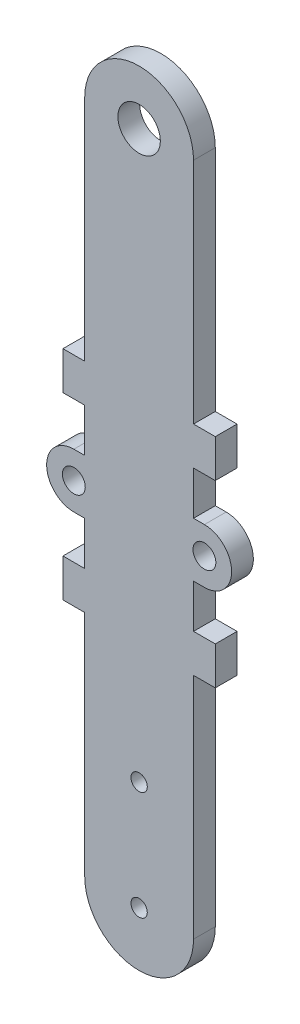
ISO-10303-21;
HEADER;
FILE_DESCRIPTION(('STEP AP214'),'2;1');
FILE_NAME('part.step','',(''),(''),'','','');
FILE_SCHEMA(('AUTOMOTIVE_DESIGN { 1 0 10303 214 1 1 1 1 }'));
ENDSEC;
DATA;
#1=APPLICATION_CONTEXT('core data for automotive mechanical design processes');
#2=APPLICATION_PROTOCOL_DEFINITION('international standard','automotive_design',2000,#1);
#3=PRODUCT_CONTEXT('',#1,'mechanical');
#4=PRODUCT('Part','Part','',(#3));
#5=PRODUCT_RELATED_PRODUCT_CATEGORY('part','',(#4));
#6=PRODUCT_DEFINITION_FORMATION('','',#4);
#7=PRODUCT_DEFINITION_CONTEXT('part definition',#1,'design');
#8=PRODUCT_DEFINITION('design','',#6,#7);
#9=PRODUCT_DEFINITION_SHAPE('','',#8);
#10=(LENGTH_UNIT() NAMED_UNIT(*) SI_UNIT(.MILLI.,.METRE.));
#11=(NAMED_UNIT(*) PLANE_ANGLE_UNIT() SI_UNIT($,.RADIAN.));
#12=(NAMED_UNIT(*) SI_UNIT($,.STERADIAN.) SOLID_ANGLE_UNIT());
#13=UNCERTAINTY_MEASURE_WITH_UNIT(LENGTH_MEASURE(1.E-05),#10,'distance_accuracy_value','');
#14=(GEOMETRIC_REPRESENTATION_CONTEXT(3) GLOBAL_UNCERTAINTY_ASSIGNED_CONTEXT((#13)) GLOBAL_UNIT_ASSIGNED_CONTEXT((#10,
#11,#12)) REPRESENTATION_CONTEXT('',''));
#15=CARTESIAN_POINT('',(0.,0.,0.));
#16=DIRECTION('',(0.,0.,1.));
#17=DIRECTION('',(1.,0.,0.));
#18=AXIS2_PLACEMENT_3D('',#15,#16,#17);
#19=CARTESIAN_POINT('',(0.,0.,4.));
#20=DIRECTION('',(0.,0.,1.));
#21=DIRECTION('',(1.,0.,0.));
#22=AXIS2_PLACEMENT_3D('',#19,#20,#21);
#23=PLANE('',#22);
#24=DIRECTION('',(0.,1.,0.));
#25=VECTOR('',#24,1.);
#26=CARTESIAN_POINT('',(10.,-72.,4.));
#27=LINE('',#26,#25);
#28=CARTESIAN_POINT('',(10.,-62.,4.));
#29=VERTEX_POINT('',#28);
#30=CARTESIAN_POINT('',(10.,-20.0000000000001,4.));
#31=VERTEX_POINT('',#30);
#32=EDGE_CURVE('E427',#29,#31,#27,.T.);
#33=ORIENTED_EDGE('',*,*,#32,.T.);
#34=DIRECTION('',(1.,0.,0.));
#35=VECTOR('',#34,1.);
#36=CARTESIAN_POINT('',(1.35308431126197E-12,-20.0000000000009,4.));
#37=LINE('',#36,#35);
#38=CARTESIAN_POINT('',(14.,-20.,4.));
#39=VERTEX_POINT('',#38);
#40=EDGE_CURVE('E271',#31,#39,#37,.T.);
#41=ORIENTED_EDGE('',*,*,#40,.T.);
#42=DIRECTION('',(0.,1.,0.));
#43=VECTOR('',#42,1.);
#44=CARTESIAN_POINT('',(14.,0.,4.));
#45=LINE('',#44,#43);
#46=CARTESIAN_POINT('',(14.,-13.,4.));
#47=VERTEX_POINT('',#46);
#48=EDGE_CURVE('E263',#39,#47,#45,.T.);
#49=ORIENTED_EDGE('',*,*,#48,.T.);
#50=DIRECTION('',(1.,0.,0.));
#51=VECTOR('',#50,1.);
#52=CARTESIAN_POINT('',(8.79504802320303E-13,-13.0000000000009,4.));
#53=LINE('',#52,#51);
#54=CARTESIAN_POINT('',(10.,-13.0000000000001,4.));
#55=VERTEX_POINT('',#54);
#56=EDGE_CURVE('E279',#55,#47,#53,.T.);
#57=ORIENTED_EDGE('',*,*,#56,.F.);
#58=CARTESIAN_POINT('',(10.,-5.,4.));
#59=VERTEX_POINT('',#58);
#60=EDGE_CURVE('E431',#55,#59,#27,.T.);
#61=ORIENTED_EDGE('',*,*,#60,.T.);
#62=DIRECTION('',(1.,0.,0.));
#63=VECTOR('',#62,1.);
#64=CARTESIAN_POINT('',(0.,-5.00000000000003,4.));
#65=LINE('',#64,#63);
#66=CARTESIAN_POINT('',(12.,-5.,4.));
#67=VERTEX_POINT('',#66);
#68=EDGE_CURVE('E311',#59,#67,#65,.T.);
#69=ORIENTED_EDGE('',*,*,#68,.T.);
#70=CARTESIAN_POINT('',(12.,0.,4.));
#71=DIRECTION('',(0.,0.,-1.));
#72=DIRECTION('',(-1.,0.,0.));
#73=AXIS2_PLACEMENT_3D('',#70,#71,#72);
#74=CIRCLE('',#73,5.);
#75=CARTESIAN_POINT('',(12.,5.,4.));
#76=VERTEX_POINT('',#75);
#77=EDGE_CURVE('E297',#76,#67,#74,.T.);
#78=ORIENTED_EDGE('',*,*,#77,.F.);
#79=DIRECTION('',(1.,0.,0.));
#80=VECTOR('',#79,1.);
#81=CARTESIAN_POINT('',(0.,5.00000000000003,4.));
#82=LINE('',#81,#80);
#83=CARTESIAN_POINT('',(10.,5.,4.));
#84=VERTEX_POINT('',#83);
#85=EDGE_CURVE('E286',#84,#76,#82,.T.);
#86=ORIENTED_EDGE('',*,*,#85,.F.);
#87=CARTESIAN_POINT('',(10.,12.9999999999998,4.));
#88=VERTEX_POINT('',#87);
#89=EDGE_CURVE('E432',#84,#88,#27,.T.);
#90=ORIENTED_EDGE('',*,*,#89,.T.);
#91=DIRECTION('',(1.,0.,0.));
#92=VECTOR('',#91,1.);
#93=CARTESIAN_POINT('',(-8.56953397132483E-13,12.9999999999991,4.));
#94=LINE('',#93,#92);
#95=CARTESIAN_POINT('',(14.,13.,4.));
#96=VERTEX_POINT('',#95);
#97=EDGE_CURVE('E254',#88,#96,#94,.T.);
#98=ORIENTED_EDGE('',*,*,#97,.T.);
#99=DIRECTION('',(0.,-1.,0.));
#100=VECTOR('',#99,1.);
#101=CARTESIAN_POINT('',(14.,0.,4.));
#102=LINE('',#101,#100);
#103=CARTESIAN_POINT('',(14.,20.,4.));
#104=VERTEX_POINT('',#103);
#105=EDGE_CURVE('E249',#104,#96,#102,.T.);
#106=ORIENTED_EDGE('',*,*,#105,.F.);
#107=DIRECTION('',(1.,0.,0.));
#108=VECTOR('',#107,1.);
#109=CARTESIAN_POINT('',(-1.31838984174231E-12,19.9999999999991,4.));
#110=LINE('',#109,#108);
#111=CARTESIAN_POINT('',(10.,19.9999999999999,4.));
#112=VERTEX_POINT('',#111);
#113=EDGE_CURVE('E258',#112,#104,#110,.T.);
#114=ORIENTED_EDGE('',*,*,#113,.F.);
#115=CARTESIAN_POINT('',(10.,62.,4.));
#116=VERTEX_POINT('',#115);
#117=EDGE_CURVE('E52',#112,#116,#27,.T.);
#118=ORIENTED_EDGE('',*,*,#117,.T.);
#119=CARTESIAN_POINT('',(0.,62.,4.));
#120=DIRECTION('',(0.,0.,1.));
#121=DIRECTION('',(1.,0.,0.));
#122=AXIS2_PLACEMENT_3D('',#119,#120,#121);
#123=CIRCLE('',#122,10.);
#124=CARTESIAN_POINT('',(-10.,62.,4.));
#125=VERTEX_POINT('',#124);
#126=EDGE_CURVE('E448',#116,#125,#123,.T.);
#127=ORIENTED_EDGE('',*,*,#126,.T.);
#128=DIRECTION('',(0.,-1.,0.));
#129=VECTOR('',#128,1.);
#130=CARTESIAN_POINT('',(-10.,-72.,4.));
#131=LINE('',#130,#129);
#132=CARTESIAN_POINT('',(-10.,19.9999999999999,4.));
#133=VERTEX_POINT('',#132);
#134=EDGE_CURVE('E433',#125,#133,#131,.T.);
#135=ORIENTED_EDGE('',*,*,#134,.T.);
#136=DIRECTION('',(-1.,0.,0.));
#137=VECTOR('',#136,1.);
#138=CARTESIAN_POINT('',(1.31838984174231E-12,19.9999999999991,4.));
#139=LINE('',#138,#137);
#140=CARTESIAN_POINT('',(-14.,20.,4.));
#141=VERTEX_POINT('',#140);
#142=EDGE_CURVE('E330',#133,#141,#139,.T.);
#143=ORIENTED_EDGE('',*,*,#142,.T.);
#144=DIRECTION('',(0.,-1.,0.));
#145=VECTOR('',#144,1.);
#146=CARTESIAN_POINT('',(-14.,0.,4.));
#147=LINE('',#146,#145);
#148=CARTESIAN_POINT('',(-14.,13.,4.));
#149=VERTEX_POINT('',#148);
#150=EDGE_CURVE('E345',#141,#149,#147,.T.);
#151=ORIENTED_EDGE('',*,*,#150,.T.);
#152=DIRECTION('',(-1.,0.,0.));
#153=VECTOR('',#152,1.);
#154=CARTESIAN_POINT('',(8.56953397132483E-13,12.9999999999991,4.));
#155=LINE('',#154,#153);
#156=CARTESIAN_POINT('',(-10.,12.9999999999999,4.));
#157=VERTEX_POINT('',#156);
#158=EDGE_CURVE('E337',#157,#149,#155,.T.);
#159=ORIENTED_EDGE('',*,*,#158,.F.);
#160=CARTESIAN_POINT('',(-10.,5.,4.));
#161=VERTEX_POINT('',#160);
#162=EDGE_CURVE('E436',#157,#161,#131,.T.);
#163=ORIENTED_EDGE('',*,*,#162,.T.);
#164=DIRECTION('',(-1.,0.,0.));
#165=VECTOR('',#164,1.);
#166=CARTESIAN_POINT('',(0.,5.00000000000003,4.));
#167=LINE('',#166,#165);
#168=CARTESIAN_POINT('',(-12.,5.,4.));
#169=VERTEX_POINT('',#168);
#170=EDGE_CURVE('E376',#161,#169,#167,.T.);
#171=ORIENTED_EDGE('',*,*,#170,.T.);
#172=CARTESIAN_POINT('',(-12.,0.,4.));
#173=DIRECTION('',(0.,0.,1.));
#174=DIRECTION('',(1.,0.,0.));
#175=AXIS2_PLACEMENT_3D('',#172,#173,#174);
#176=CIRCLE('',#175,5.);
#177=CARTESIAN_POINT('',(-12.,-5.,4.));
#178=VERTEX_POINT('',#177);
#179=EDGE_CURVE('E399',#169,#178,#176,.T.);
#180=ORIENTED_EDGE('',*,*,#179,.T.);
#181=DIRECTION('',(-1.,0.,0.));
#182=VECTOR('',#181,1.);
#183=CARTESIAN_POINT('',(0.,-5.00000000000003,4.));
#184=LINE('',#183,#182);
#185=CARTESIAN_POINT('',(-10.,-5.,4.));
#186=VERTEX_POINT('',#185);
#187=EDGE_CURVE('E402',#186,#178,#184,.T.);
#188=ORIENTED_EDGE('',*,*,#187,.F.);
#189=CARTESIAN_POINT('',(-10.,-13.0000000000002,4.));
#190=VERTEX_POINT('',#189);
#191=EDGE_CURVE('E437',#186,#190,#131,.T.);
#192=ORIENTED_EDGE('',*,*,#191,.T.);
#193=DIRECTION('',(-1.,0.,0.));
#194=VECTOR('',#193,1.);
#195=CARTESIAN_POINT('',(-8.79504802320303E-13,-13.0000000000009,4.));
#196=LINE('',#195,#194);
#197=CARTESIAN_POINT('',(-14.,-13.,4.));
#198=VERTEX_POINT('',#197);
#199=EDGE_CURVE('E362',#190,#198,#196,.T.);
#200=ORIENTED_EDGE('',*,*,#199,.T.);
#201=DIRECTION('',(0.,1.,0.));
#202=VECTOR('',#201,1.);
#203=CARTESIAN_POINT('',(-14.,0.,4.));
#204=LINE('',#203,#202);
#205=CARTESIAN_POINT('',(-14.,-20.,4.));
#206=VERTEX_POINT('',#205);
#207=EDGE_CURVE('E352',#206,#198,#204,.T.);
#208=ORIENTED_EDGE('',*,*,#207,.F.);
#209=DIRECTION('',(-1.,0.,0.));
#210=VECTOR('',#209,1.);
#211=CARTESIAN_POINT('',(-1.35308431126197E-12,-20.0000000000009,4.));
#212=LINE('',#211,#210);
#213=CARTESIAN_POINT('',(-10.,-20.0000000000001,4.));
#214=VERTEX_POINT('',#213);
#215=EDGE_CURVE('E370',#214,#206,#212,.T.);
#216=ORIENTED_EDGE('',*,*,#215,.F.);
#217=CARTESIAN_POINT('',(-10.,-62.,4.));
#218=VERTEX_POINT('',#217);
#219=EDGE_CURVE('E430',#214,#218,#131,.T.);
#220=ORIENTED_EDGE('',*,*,#219,.T.);
#221=CARTESIAN_POINT('',(0.,-62.,4.));
#222=DIRECTION('',(0.,0.,1.));
#223=DIRECTION('',(1.,0.,0.));
#224=AXIS2_PLACEMENT_3D('',#221,#222,#223);
#225=CIRCLE('',#224,10.);
#226=EDGE_CURVE('E11',#218,#29,#225,.T.);
#227=ORIENTED_EDGE('',*,*,#226,.T.);
#228=EDGE_LOOP('',(#33,#41,#49,#57,#61,#69,#78,#86,#90,#98,#106,#114,#118,#127,#135,#143,#151,
#159,#163,#171,#180,#188,#192,#200,#208,#216,#220,#227));
#229=FACE_BOUND('',#228,.T.);
#230=CARTESIAN_POINT('',(-12.,0.,4.));
#231=DIRECTION('',(0.,0.,1.));
#232=DIRECTION('',(1.,0.,0.));
#233=AXIS2_PLACEMENT_3D('',#230,#231,#232);
#234=CIRCLE('',#233,2.1);
#235=CARTESIAN_POINT('',(-9.89999999999999,0.,4.));
#236=VERTEX_POINT('',#235);
#237=EDGE_CURVE('E388',#236,#236,#234,.T.);
#238=ORIENTED_EDGE('',*,*,#237,.F.);
#239=EDGE_LOOP('',(#238));
#240=FACE_BOUND('',#239,.T.);
#241=CARTESIAN_POINT('',(0.,-42.,4.));
#242=DIRECTION('',(0.,0.,-1.));
#243=DIRECTION('',(-1.,0.,0.));
#244=AXIS2_PLACEMENT_3D('',#241,#242,#243);
#245=CIRCLE('',#244,1.5);
#246=CARTESIAN_POINT('',(-1.5,-42.,4.));
#247=VERTEX_POINT('',#246);
#248=EDGE_CURVE('E327',#247,#247,#245,.T.);
#249=ORIENTED_EDGE('',*,*,#248,.T.);
#250=EDGE_LOOP('',(#249));
#251=FACE_BOUND('',#250,.T.);
#252=CARTESIAN_POINT('',(0.,-62.,4.));
#253=DIRECTION('',(0.,0.,1.));
#254=DIRECTION('',(1.,0.,0.));
#255=AXIS2_PLACEMENT_3D('',#252,#253,#254);
#256=CIRCLE('',#255,1.5);
#257=CARTESIAN_POINT('',(1.5,-62.,4.));
#258=VERTEX_POINT('',#257);
#259=EDGE_CURVE('E234',#258,#258,#256,.T.);
#260=ORIENTED_EDGE('',*,*,#259,.F.);
#261=EDGE_LOOP('',(#260));
#262=FACE_BOUND('',#261,.T.);
#263=CARTESIAN_POINT('',(0.,62.,4.));
#264=DIRECTION('',(0.,0.,1.));
#265=DIRECTION('',(1.,0.,0.));
#266=AXIS2_PLACEMENT_3D('',#263,#264,#265);
#267=CIRCLE('',#266,3.9);
#268=CARTESIAN_POINT('',(3.9,62.,4.));
#269=VERTEX_POINT('',#268);
#270=EDGE_CURVE('E417',#269,#269,#267,.T.);
#271=ORIENTED_EDGE('',*,*,#270,.F.);
#272=EDGE_LOOP('',(#271));
#273=FACE_BOUND('',#272,.T.);
#274=CARTESIAN_POINT('',(12.,0.,4.));
#275=DIRECTION('',(0.,0.,-1.));
#276=DIRECTION('',(-1.,0.,0.));
#277=AXIS2_PLACEMENT_3D('',#274,#275,#276);
#278=CIRCLE('',#277,2.1);
#279=CARTESIAN_POINT('',(9.89999999999999,0.,4.));
#280=VERTEX_POINT('',#279);
#281=EDGE_CURVE('E308',#280,#280,#278,.T.);
#282=ORIENTED_EDGE('',*,*,#281,.T.);
#283=EDGE_LOOP('',(#282));
#284=FACE_BOUND('',#283,.T.);
#285=ADVANCED_FACE('F36',(#229,#240,#251,#262,#273,#284),#23,.T.);
#286=CARTESIAN_POINT('',(0.,0.,0.));
#287=DIRECTION('',(0.,0.,1.));
#288=DIRECTION('',(1.,0.,0.));
#289=AXIS2_PLACEMENT_3D('',#286,#287,#288);
#290=PLANE('',#289);
#291=CARTESIAN_POINT('',(0.,62.,0.));
#292=DIRECTION('',(0.,0.,1.));
#293=DIRECTION('',(1.,0.,0.));
#294=AXIS2_PLACEMENT_3D('',#291,#292,#293);
#295=CIRCLE('',#294,3.9);
#296=CARTESIAN_POINT('',(3.9,62.,0.));
#297=VERTEX_POINT('',#296);
#298=EDGE_CURVE('E410',#297,#297,#295,.T.);
#299=ORIENTED_EDGE('',*,*,#298,.T.);
#300=EDGE_LOOP('',(#299));
#301=FACE_BOUND('',#300,.T.);
#302=CARTESIAN_POINT('',(0.,-62.,0.));
#303=DIRECTION('',(0.,0.,1.));
#304=DIRECTION('',(1.,0.,0.));
#305=AXIS2_PLACEMENT_3D('',#302,#303,#304);
#306=CIRCLE('',#305,1.5);
#307=CARTESIAN_POINT('',(1.5,-62.,0.));
#308=VERTEX_POINT('',#307);
#309=EDGE_CURVE('E420',#308,#308,#306,.T.);
#310=ORIENTED_EDGE('',*,*,#309,.T.);
#311=EDGE_LOOP('',(#310));
#312=FACE_BOUND('',#311,.T.);
#313=CARTESIAN_POINT('',(-12.,0.,0.));
#314=DIRECTION('',(0.,0.,1.));
#315=DIRECTION('',(1.,0.,0.));
#316=AXIS2_PLACEMENT_3D('',#313,#314,#315);
#317=CIRCLE('',#316,2.1);
#318=CARTESIAN_POINT('',(-9.89999999999999,0.,0.));
#319=VERTEX_POINT('',#318);
#320=EDGE_CURVE('E393',#319,#319,#317,.T.);
#321=ORIENTED_EDGE('',*,*,#320,.T.);
#322=EDGE_LOOP('',(#321));
#323=FACE_BOUND('',#322,.T.);
#324=CARTESIAN_POINT('',(0.,-42.,0.));
#325=DIRECTION('',(0.,0.,-1.));
#326=DIRECTION('',(-1.,0.,0.));
#327=AXIS2_PLACEMENT_3D('',#324,#325,#326);
#328=CIRCLE('',#327,1.5);
#329=CARTESIAN_POINT('',(-1.5,-42.,0.));
#330=VERTEX_POINT('',#329);
#331=EDGE_CURVE('E319',#330,#330,#328,.T.);
#332=ORIENTED_EDGE('',*,*,#331,.F.);
#333=EDGE_LOOP('',(#332));
#334=FACE_BOUND('',#333,.T.);
#335=DIRECTION('',(1.,0.,0.));
#336=VECTOR('',#335,1.);
#337=CARTESIAN_POINT('',(0.,-5.00000000000003,0.));
#338=LINE('',#337,#336);
#339=CARTESIAN_POINT('',(10.,-5.,0.));
#340=VERTEX_POINT('',#339);
#341=CARTESIAN_POINT('',(12.,-5.,0.));
#342=VERTEX_POINT('',#341);
#343=EDGE_CURVE('E300',#340,#342,#338,.T.);
#344=ORIENTED_EDGE('',*,*,#343,.F.);
#345=DIRECTION('',(0.,1.,0.));
#346=VECTOR('',#345,1.);
#347=CARTESIAN_POINT('',(10.,-72.,0.));
#348=LINE('',#347,#346);
#349=CARTESIAN_POINT('',(10.,-13.0000000000002,0.));
#350=VERTEX_POINT('',#349);
#351=EDGE_CURVE('E236',#350,#340,#348,.T.);
#352=ORIENTED_EDGE('',*,*,#351,.F.);
#353=DIRECTION('',(1.,0.,0.));
#354=VECTOR('',#353,1.);
#355=CARTESIAN_POINT('',(8.79504802320303E-13,-13.0000000000009,0.));
#356=LINE('',#355,#354);
#357=CARTESIAN_POINT('',(14.,-13.,0.));
#358=VERTEX_POINT('',#357);
#359=EDGE_CURVE('E270',#350,#358,#356,.T.);
#360=ORIENTED_EDGE('',*,*,#359,.T.);
#361=DIRECTION('',(0.,1.,0.));
#362=VECTOR('',#361,1.);
#363=CARTESIAN_POINT('',(14.,0.,0.));
#364=LINE('',#363,#362);
#365=CARTESIAN_POINT('',(14.,-20.,0.));
#366=VERTEX_POINT('',#365);
#367=EDGE_CURVE('E267',#366,#358,#364,.T.);
#368=ORIENTED_EDGE('',*,*,#367,.F.);
#369=DIRECTION('',(1.,0.,0.));
#370=VECTOR('',#369,1.);
#371=CARTESIAN_POINT('',(1.35308431126197E-12,-20.0000000000009,0.));
#372=LINE('',#371,#370);
#373=CARTESIAN_POINT('',(10.,-20.0000000000001,0.));
#374=VERTEX_POINT('',#373);
#375=EDGE_CURVE('E273',#374,#366,#372,.T.);
#376=ORIENTED_EDGE('',*,*,#375,.F.);
#377=CARTESIAN_POINT('',(10.,-62.,0.));
#378=VERTEX_POINT('',#377);
#379=EDGE_CURVE('E237',#378,#374,#348,.T.);
#380=ORIENTED_EDGE('',*,*,#379,.F.);
#381=CARTESIAN_POINT('',(0.,-62.,0.));
#382=DIRECTION('',(0.,0.,1.));
#383=DIRECTION('',(1.,0.,0.));
#384=AXIS2_PLACEMENT_3D('',#381,#382,#383);
#385=CIRCLE('',#384,10.);
#386=CARTESIAN_POINT('',(-10.,-62.,0.));
#387=VERTEX_POINT('',#386);
#388=EDGE_CURVE('E45',#378,#387,#385,.F.);
#389=ORIENTED_EDGE('',*,*,#388,.T.);
#390=DIRECTION('',(0.,-1.,0.));
#391=VECTOR('',#390,1.);
#392=CARTESIAN_POINT('',(-10.,-72.,0.));
#393=LINE('',#392,#391);
#394=CARTESIAN_POINT('',(-10.,-20.0000000000001,0.));
#395=VERTEX_POINT('',#394);
#396=EDGE_CURVE('E439',#395,#387,#393,.T.);
#397=ORIENTED_EDGE('',*,*,#396,.F.);
#398=DIRECTION('',(-1.,0.,0.));
#399=VECTOR('',#398,1.);
#400=CARTESIAN_POINT('',(-1.35308431126197E-12,-20.0000000000009,0.));
#401=LINE('',#400,#399);
#402=CARTESIAN_POINT('',(-14.,-20.,0.));
#403=VERTEX_POINT('',#402);
#404=EDGE_CURVE('E361',#395,#403,#401,.T.);
#405=ORIENTED_EDGE('',*,*,#404,.T.);
#406=DIRECTION('',(0.,1.,0.));
#407=VECTOR('',#406,1.);
#408=CARTESIAN_POINT('',(-14.,0.,0.));
#409=LINE('',#408,#407);
#410=CARTESIAN_POINT('',(-14.,-13.,0.));
#411=VERTEX_POINT('',#410);
#412=EDGE_CURVE('E359',#403,#411,#409,.T.);
#413=ORIENTED_EDGE('',*,*,#412,.T.);
#414=DIRECTION('',(-1.,0.,0.));
#415=VECTOR('',#414,1.);
#416=CARTESIAN_POINT('',(-8.79504802320303E-13,-13.0000000000009,0.));
#417=LINE('',#416,#415);
#418=CARTESIAN_POINT('',(-10.,-13.0000000000002,0.));
#419=VERTEX_POINT('',#418);
#420=EDGE_CURVE('E364',#419,#411,#417,.T.);
#421=ORIENTED_EDGE('',*,*,#420,.F.);
#422=CARTESIAN_POINT('',(-10.,-5.,0.));
#423=VERTEX_POINT('',#422);
#424=EDGE_CURVE('E443',#423,#419,#393,.T.);
#425=ORIENTED_EDGE('',*,*,#424,.F.);
#426=DIRECTION('',(-1.,0.,0.));
#427=VECTOR('',#426,1.);
#428=CARTESIAN_POINT('',(0.,-5.00000000000003,0.));
#429=LINE('',#428,#427);
#430=CARTESIAN_POINT('',(-12.,-5.,0.));
#431=VERTEX_POINT('',#430);
#432=EDGE_CURVE('E391',#423,#431,#429,.T.);
#433=ORIENTED_EDGE('',*,*,#432,.T.);
#434=CARTESIAN_POINT('',(-12.,0.,0.));
#435=DIRECTION('',(0.,0.,1.));
#436=DIRECTION('',(1.,0.,0.));
#437=AXIS2_PLACEMENT_3D('',#434,#435,#436);
#438=CIRCLE('',#437,5.);
#439=CARTESIAN_POINT('',(-12.,5.,0.));
#440=VERTEX_POINT('',#439);
#441=EDGE_CURVE('E387',#440,#431,#438,.T.);
#442=ORIENTED_EDGE('',*,*,#441,.F.);
#443=DIRECTION('',(-1.,0.,0.));
#444=VECTOR('',#443,1.);
#445=CARTESIAN_POINT('',(0.,5.00000000000003,0.));
#446=LINE('',#445,#444);
#447=CARTESIAN_POINT('',(-10.,5.,0.));
#448=VERTEX_POINT('',#447);
#449=EDGE_CURVE('E384',#448,#440,#446,.T.);
#450=ORIENTED_EDGE('',*,*,#449,.F.);
#451=CARTESIAN_POINT('',(-10.,12.9999999999998,0.));
#452=VERTEX_POINT('',#451);
#453=EDGE_CURVE('E442',#452,#448,#393,.T.);
#454=ORIENTED_EDGE('',*,*,#453,.F.);
#455=DIRECTION('',(-1.,0.,0.));
#456=VECTOR('',#455,1.);
#457=CARTESIAN_POINT('',(8.56953397132483E-13,12.9999999999991,0.));
#458=LINE('',#457,#456);
#459=CARTESIAN_POINT('',(-14.,13.,0.));
#460=VERTEX_POINT('',#459);
#461=EDGE_CURVE('E340',#452,#460,#458,.T.);
#462=ORIENTED_EDGE('',*,*,#461,.T.);
#463=DIRECTION('',(0.,-1.,0.));
#464=VECTOR('',#463,1.);
#465=CARTESIAN_POINT('',(-14.,0.,0.));
#466=LINE('',#465,#464);
#467=CARTESIAN_POINT('',(-14.,20.,0.));
#468=VERTEX_POINT('',#467);
#469=EDGE_CURVE('E336',#468,#460,#466,.T.);
#470=ORIENTED_EDGE('',*,*,#469,.F.);
#471=DIRECTION('',(-1.,0.,0.));
#472=VECTOR('',#471,1.);
#473=CARTESIAN_POINT('',(1.31838984174231E-12,19.9999999999991,0.));
#474=LINE('',#473,#472);
#475=CARTESIAN_POINT('',(-10.,19.9999999999999,0.));
#476=VERTEX_POINT('',#475);
#477=EDGE_CURVE('E333',#476,#468,#474,.T.);
#478=ORIENTED_EDGE('',*,*,#477,.F.);
#479=CARTESIAN_POINT('',(-10.,62.,0.));
#480=VERTEX_POINT('',#479);
#481=EDGE_CURVE('E440',#480,#476,#393,.T.);
#482=ORIENTED_EDGE('',*,*,#481,.F.);
#483=CARTESIAN_POINT('',(0.,62.,0.));
#484=DIRECTION('',(0.,0.,1.));
#485=DIRECTION('',(1.,0.,0.));
#486=AXIS2_PLACEMENT_3D('',#483,#484,#485);
#487=CIRCLE('',#486,10.);
#488=CARTESIAN_POINT('',(10.,62.,0.));
#489=VERTEX_POINT('',#488);
#490=EDGE_CURVE('E231',#480,#489,#487,.F.);
#491=ORIENTED_EDGE('',*,*,#490,.T.);
#492=CARTESIAN_POINT('',(10.,19.9999999999999,0.));
#493=VERTEX_POINT('',#492);
#494=EDGE_CURVE('E223',#493,#489,#348,.T.);
#495=ORIENTED_EDGE('',*,*,#494,.F.);
#496=DIRECTION('',(1.,0.,0.));
#497=VECTOR('',#496,1.);
#498=CARTESIAN_POINT('',(-1.31838984174231E-12,19.9999999999991,0.));
#499=LINE('',#498,#497);
#500=CARTESIAN_POINT('',(14.,20.,0.));
#501=VERTEX_POINT('',#500);
#502=EDGE_CURVE('E228',#493,#501,#499,.T.);
#503=ORIENTED_EDGE('',*,*,#502,.T.);
#504=DIRECTION('',(0.,-1.,0.));
#505=VECTOR('',#504,1.);
#506=CARTESIAN_POINT('',(14.,0.,0.));
#507=LINE('',#506,#505);
#508=CARTESIAN_POINT('',(14.,13.,0.));
#509=VERTEX_POINT('',#508);
#510=EDGE_CURVE('E243',#501,#509,#507,.T.);
#511=ORIENTED_EDGE('',*,*,#510,.T.);
#512=DIRECTION('',(1.,0.,0.));
#513=VECTOR('',#512,1.);
#514=CARTESIAN_POINT('',(-8.56953397132483E-13,12.9999999999991,0.));
#515=LINE('',#514,#513);
#516=CARTESIAN_POINT('',(10.,12.9999999999998,0.));
#517=VERTEX_POINT('',#516);
#518=EDGE_CURVE('E248',#517,#509,#515,.T.);
#519=ORIENTED_EDGE('',*,*,#518,.F.);
#520=CARTESIAN_POINT('',(10.,5.,0.));
#521=VERTEX_POINT('',#520);
#522=EDGE_CURVE('E233',#521,#517,#348,.T.);
#523=ORIENTED_EDGE('',*,*,#522,.F.);
#524=DIRECTION('',(1.,0.,0.));
#525=VECTOR('',#524,1.);
#526=CARTESIAN_POINT('',(0.,5.00000000000003,0.));
#527=LINE('',#526,#525);
#528=CARTESIAN_POINT('',(12.,5.,0.));
#529=VERTEX_POINT('',#528);
#530=EDGE_CURVE('E293',#521,#529,#527,.T.);
#531=ORIENTED_EDGE('',*,*,#530,.T.);
#532=CARTESIAN_POINT('',(12.,0.,0.));
#533=DIRECTION('',(0.,0.,-1.));
#534=DIRECTION('',(-1.,0.,0.));
#535=AXIS2_PLACEMENT_3D('',#532,#533,#534);
#536=CIRCLE('',#535,5.);
#537=EDGE_CURVE('E303',#529,#342,#536,.T.);
#538=ORIENTED_EDGE('',*,*,#537,.T.);
#539=EDGE_LOOP('',(#344,#352,#360,#368,#376,#380,#389,#397,#405,#413,#421,#425,#433,#442,#450,
#454,#462,#470,#478,#482,#491,#495,#503,#511,#519,#523,#531,#538));
#540=FACE_BOUND('',#539,.T.);
#541=CARTESIAN_POINT('',(12.,0.,0.));
#542=DIRECTION('',(0.,0.,-1.));
#543=DIRECTION('',(-1.,0.,0.));
#544=AXIS2_PLACEMENT_3D('',#541,#542,#543);
#545=CIRCLE('',#544,2.1);
#546=CARTESIAN_POINT('',(9.89999999999999,0.,0.));
#547=VERTEX_POINT('',#546);
#548=EDGE_CURVE('E296',#547,#547,#545,.T.);
#549=ORIENTED_EDGE('',*,*,#548,.F.);
#550=EDGE_LOOP('',(#549));
#551=FACE_BOUND('',#550,.T.);
#552=ADVANCED_FACE('F225',(#301,#312,#323,#334,#540,#551),#290,.F.);
#553=CARTESIAN_POINT('',(10.,-72.,4.));
#554=DIRECTION('',(-1.,0.,0.));
#555=DIRECTION('',(0.,0.,1.));
#556=AXIS2_PLACEMENT_3D('',#553,#554,#555);
#557=PLANE('',#556);
#558=DIRECTION('',(0.,0.,1.));
#559=VECTOR('',#558,1.);
#560=CARTESIAN_POINT('',(10.,19.9999999999999,0.));
#561=LINE('',#560,#559);
#562=EDGE_CURVE('E238',#493,#112,#561,.T.);
#563=ORIENTED_EDGE('',*,*,#562,.F.);
#564=ORIENTED_EDGE('',*,*,#494,.T.);
#565=DIRECTION('',(0.,0.,-1.));
#566=VECTOR('',#565,1.);
#567=CARTESIAN_POINT('',(10.,62.,4.));
#568=LINE('',#567,#566);
#569=EDGE_CURVE('E446',#489,#116,#568,.F.);
#570=ORIENTED_EDGE('',*,*,#569,.T.);
#571=ORIENTED_EDGE('',*,*,#117,.F.);
#572=EDGE_LOOP('',(#563,#564,#570,#571));
#573=FACE_BOUND('',#572,.T.);
#574=ADVANCED_FACE('F239',(#573),#557,.F.);
#575=DIRECTION('',(0.,0.,1.));
#576=VECTOR('',#575,1.);
#577=CARTESIAN_POINT('',(10.,-13.0000000000002,0.));
#578=LINE('',#577,#576);
#579=EDGE_CURVE('E289',#350,#55,#578,.T.);
#580=ORIENTED_EDGE('',*,*,#579,.F.);
#581=ORIENTED_EDGE('',*,*,#351,.T.);
#582=DIRECTION('',(0.,0.,1.));
#583=VECTOR('',#582,1.);
#584=CARTESIAN_POINT('',(10.,-5.,0.));
#585=LINE('',#584,#583);
#586=EDGE_CURVE('E322',#340,#59,#585,.T.);
#587=ORIENTED_EDGE('',*,*,#586,.T.);
#588=ORIENTED_EDGE('',*,*,#60,.F.);
#589=EDGE_LOOP('',(#580,#581,#587,#588));
#590=FACE_BOUND('',#589,.T.);
#591=ADVANCED_FACE('F530',(#590),#557,.F.);
#592=ORIENTED_EDGE('',*,*,#522,.T.);
#593=DIRECTION('',(0.,0.,1.));
#594=VECTOR('',#593,1.);
#595=CARTESIAN_POINT('',(10.,12.9999999999998,0.));
#596=LINE('',#595,#594);
#597=EDGE_CURVE('E60',#517,#88,#596,.T.);
#598=ORIENTED_EDGE('',*,*,#597,.T.);
#599=ORIENTED_EDGE('',*,*,#89,.F.);
#600=DIRECTION('',(0.,0.,1.));
#601=VECTOR('',#600,1.);
#602=CARTESIAN_POINT('',(10.,5.,0.));
#603=LINE('',#602,#601);
#604=EDGE_CURVE('E305',#521,#84,#603,.T.);
#605=ORIENTED_EDGE('',*,*,#604,.F.);
#606=EDGE_LOOP('',(#592,#598,#599,#605));
#607=FACE_BOUND('',#606,.T.);
#608=ADVANCED_FACE('F671',(#607),#557,.F.);
#609=ORIENTED_EDGE('',*,*,#379,.T.);
#610=DIRECTION('',(0.,0.,1.));
#611=VECTOR('',#610,1.);
#612=CARTESIAN_POINT('',(10.,-20.0000000000001,0.));
#613=LINE('',#612,#611);
#614=EDGE_CURVE('E287',#374,#31,#613,.T.);
#615=ORIENTED_EDGE('',*,*,#614,.T.);
#616=ORIENTED_EDGE('',*,*,#32,.F.);
#617=DIRECTION('',(0.,0.,-1.));
#618=VECTOR('',#617,1.);
#619=CARTESIAN_POINT('',(10.,-62.,4.));
#620=LINE('',#619,#618);
#621=EDGE_CURVE('E454',#29,#378,#620,.T.);
#622=ORIENTED_EDGE('',*,*,#621,.T.);
#623=EDGE_LOOP('',(#609,#615,#616,#622));
#624=FACE_BOUND('',#623,.T.);
#625=ADVANCED_FACE('F531',(#624),#557,.F.);
#626=CARTESIAN_POINT('',(0.,-62.,0.));
#627=DIRECTION('',(0.,0.,-1.));
#628=DIRECTION('',(-1.,0.,0.));
#629=AXIS2_PLACEMENT_3D('',#626,#627,#628);
#630=CYLINDRICAL_SURFACE('',#629,10.);
#631=DIRECTION('',(0.,0.,-1.));
#632=VECTOR('',#631,1.);
#633=CARTESIAN_POINT('',(-10.,-62.,4.));
#634=LINE('',#633,#632);
#635=EDGE_CURVE('E451',#387,#218,#634,.F.);
#636=ORIENTED_EDGE('',*,*,#635,.F.);
#637=ORIENTED_EDGE('',*,*,#388,.F.);
#638=ORIENTED_EDGE('',*,*,#621,.F.);
#639=ORIENTED_EDGE('',*,*,#226,.F.);
#640=EDGE_LOOP('',(#636,#637,#638,#639));
#641=FACE_BOUND('',#640,.T.);
#642=ADVANCED_FACE('F39',(#641),#630,.T.);
#643=CARTESIAN_POINT('',(-10.,-72.,4.));
#644=DIRECTION('',(1.,0.,0.));
#645=DIRECTION('',(0.,0.,-1.));
#646=AXIS2_PLACEMENT_3D('',#643,#644,#645);
#647=PLANE('',#646);
#648=DIRECTION('',(0.,0.,1.));
#649=VECTOR('',#648,1.);
#650=CARTESIAN_POINT('',(-10.,12.9999999999998,0.));
#651=LINE('',#650,#649);
#652=EDGE_CURVE('E353',#452,#157,#651,.T.);
#653=ORIENTED_EDGE('',*,*,#652,.F.);
#654=ORIENTED_EDGE('',*,*,#453,.T.);
#655=DIRECTION('',(0.,0.,1.));
#656=VECTOR('',#655,1.);
#657=CARTESIAN_POINT('',(-10.,5.,0.));
#658=LINE('',#657,#656);
#659=EDGE_CURVE('E407',#448,#161,#658,.T.);
#660=ORIENTED_EDGE('',*,*,#659,.T.);
#661=ORIENTED_EDGE('',*,*,#162,.F.);
#662=EDGE_LOOP('',(#653,#654,#660,#661));
#663=FACE_BOUND('',#662,.T.);
#664=ADVANCED_FACE('F470',(#663),#647,.F.);
#665=ORIENTED_EDGE('',*,*,#396,.T.);
#666=ORIENTED_EDGE('',*,*,#635,.T.);
#667=ORIENTED_EDGE('',*,*,#219,.F.);
#668=DIRECTION('',(0.,0.,1.));
#669=VECTOR('',#668,1.);
#670=CARTESIAN_POINT('',(-10.,-20.0000000000001,0.));
#671=LINE('',#670,#669);
#672=EDGE_CURVE('E379',#395,#214,#671,.T.);
#673=ORIENTED_EDGE('',*,*,#672,.F.);
#674=EDGE_LOOP('',(#665,#666,#667,#673));
#675=FACE_BOUND('',#674,.T.);
#676=ADVANCED_FACE('F465',(#675),#647,.F.);
#677=ORIENTED_EDGE('',*,*,#481,.T.);
#678=DIRECTION('',(0.,0.,1.));
#679=VECTOR('',#678,1.);
#680=CARTESIAN_POINT('',(-10.,19.9999999999999,0.));
#681=LINE('',#680,#679);
#682=EDGE_CURVE('E350',#476,#133,#681,.T.);
#683=ORIENTED_EDGE('',*,*,#682,.T.);
#684=ORIENTED_EDGE('',*,*,#134,.F.);
#685=DIRECTION('',(0.,0.,-1.));
#686=VECTOR('',#685,1.);
#687=CARTESIAN_POINT('',(-10.,62.,4.));
#688=LINE('',#687,#686);
#689=EDGE_CURVE('E435',#125,#480,#688,.T.);
#690=ORIENTED_EDGE('',*,*,#689,.T.);
#691=EDGE_LOOP('',(#677,#683,#684,#690));
#692=FACE_BOUND('',#691,.T.);
#693=ADVANCED_FACE('F544',(#692),#647,.F.);
#694=ORIENTED_EDGE('',*,*,#424,.T.);
#695=DIRECTION('',(0.,0.,1.));
#696=VECTOR('',#695,1.);
#697=CARTESIAN_POINT('',(-10.,-13.0000000000002,0.));
#698=LINE('',#697,#696);
#699=EDGE_CURVE('E377',#419,#190,#698,.T.);
#700=ORIENTED_EDGE('',*,*,#699,.T.);
#701=ORIENTED_EDGE('',*,*,#191,.F.);
#702=DIRECTION('',(0.,0.,1.));
#703=VECTOR('',#702,1.);
#704=CARTESIAN_POINT('',(-10.,-5.,0.));
#705=LINE('',#704,#703);
#706=EDGE_CURVE('E411',#423,#186,#705,.T.);
#707=ORIENTED_EDGE('',*,*,#706,.F.);
#708=EDGE_LOOP('',(#694,#700,#701,#707));
#709=FACE_BOUND('',#708,.T.);
#710=ADVANCED_FACE('F502',(#709),#647,.F.);
#711=CARTESIAN_POINT('',(0.,62.,4.));
#712=DIRECTION('',(0.,0.,-1.));
#713=DIRECTION('',(-1.,0.,0.));
#714=AXIS2_PLACEMENT_3D('',#711,#712,#713);
#715=CYLINDRICAL_SURFACE('',#714,10.);
#716=ORIENTED_EDGE('',*,*,#689,.F.);
#717=ORIENTED_EDGE('',*,*,#126,.F.);
#718=ORIENTED_EDGE('',*,*,#569,.F.);
#719=ORIENTED_EDGE('',*,*,#490,.F.);
#720=EDGE_LOOP('',(#716,#717,#718,#719));
#721=FACE_BOUND('',#720,.T.);
#722=ADVANCED_FACE('F533',(#721),#715,.T.);
#723=CARTESIAN_POINT('',(0.,-62.,4.));
#724=DIRECTION('',(0.,0.,-1.));
#725=DIRECTION('',(-1.,0.,0.));
#726=AXIS2_PLACEMENT_3D('',#723,#724,#725);
#727=CYLINDRICAL_SURFACE('',#726,1.5);
#728=ORIENTED_EDGE('',*,*,#259,.T.);
#729=EDGE_LOOP('',(#728));
#730=FACE_BOUND('',#729,.T.);
#731=ORIENTED_EDGE('',*,*,#309,.F.);
#732=EDGE_LOOP('',(#731));
#733=FACE_BOUND('',#732,.T.);
#734=ADVANCED_FACE('F524',(#730,#733),#727,.F.);
#735=CARTESIAN_POINT('',(0.,62.,4.));
#736=DIRECTION('',(0.,0.,-1.));
#737=DIRECTION('',(-1.,0.,0.));
#738=AXIS2_PLACEMENT_3D('',#735,#736,#737);
#739=CYLINDRICAL_SURFACE('',#738,3.9);
#740=ORIENTED_EDGE('',*,*,#270,.T.);
#741=EDGE_LOOP('',(#740));
#742=FACE_BOUND('',#741,.T.);
#743=ORIENTED_EDGE('',*,*,#298,.F.);
#744=EDGE_LOOP('',(#743));
#745=FACE_BOUND('',#744,.T.);
#746=ADVANCED_FACE('F542',(#742,#745),#739,.F.);
#747=CARTESIAN_POINT('',(0.,5.00000000000003,0.));
#748=DIRECTION('',(0.,1.,0.));
#749=DIRECTION('',(-1.,0.,0.));
#750=AXIS2_PLACEMENT_3D('',#747,#748,#749);
#751=PLANE('',#750);
#752=ORIENTED_EDGE('',*,*,#170,.F.);
#753=ORIENTED_EDGE('',*,*,#659,.F.);
#754=ORIENTED_EDGE('',*,*,#449,.T.);
#755=DIRECTION('',(0.,0.,1.));
#756=VECTOR('',#755,1.);
#757=CARTESIAN_POINT('',(-12.,5.,0.));
#758=LINE('',#757,#756);
#759=EDGE_CURVE('E396',#440,#169,#758,.T.);
#760=ORIENTED_EDGE('',*,*,#759,.T.);
#761=EDGE_LOOP('',(#752,#753,#754,#760));
#762=FACE_BOUND('',#761,.T.);
#763=ADVANCED_FACE('F475',(#762),#751,.T.);
#764=CARTESIAN_POINT('',(-12.,0.,0.));
#765=DIRECTION('',(0.,0.,1.));
#766=DIRECTION('',(1.,0.,0.));
#767=AXIS2_PLACEMENT_3D('',#764,#765,#766);
#768=CYLINDRICAL_SURFACE('',#767,2.1);
#769=ORIENTED_EDGE('',*,*,#237,.T.);
#770=EDGE_LOOP('',(#769));
#771=FACE_BOUND('',#770,.T.);
#772=ORIENTED_EDGE('',*,*,#320,.F.);
#773=EDGE_LOOP('',(#772));
#774=FACE_BOUND('',#773,.T.);
#775=ADVANCED_FACE('F507',(#771,#774),#768,.F.);
#776=CARTESIAN_POINT('',(0.,-5.00000000000003,0.));
#777=DIRECTION('',(0.,1.,0.));
#778=DIRECTION('',(-1.,0.,0.));
#779=AXIS2_PLACEMENT_3D('',#776,#777,#778);
#780=PLANE('',#779);
#781=ORIENTED_EDGE('',*,*,#187,.T.);
#782=DIRECTION('',(0.,0.,1.));
#783=VECTOR('',#782,1.);
#784=CARTESIAN_POINT('',(-12.,-5.,0.));
#785=LINE('',#784,#783);
#786=EDGE_CURVE('E414',#431,#178,#785,.T.);
#787=ORIENTED_EDGE('',*,*,#786,.F.);
#788=ORIENTED_EDGE('',*,*,#432,.F.);
#789=ORIENTED_EDGE('',*,*,#706,.T.);
#790=EDGE_LOOP('',(#781,#787,#788,#789));
#791=FACE_BOUND('',#790,.T.);
#792=ADVANCED_FACE('F505',(#791),#780,.F.);
#793=CARTESIAN_POINT('',(-12.,0.,0.));
#794=DIRECTION('',(0.,0.,1.));
#795=DIRECTION('',(1.,0.,0.));
#796=AXIS2_PLACEMENT_3D('',#793,#794,#795);
#797=CYLINDRICAL_SURFACE('',#796,5.);
#798=ORIENTED_EDGE('',*,*,#179,.F.);
#799=ORIENTED_EDGE('',*,*,#759,.F.);
#800=ORIENTED_EDGE('',*,*,#441,.T.);
#801=ORIENTED_EDGE('',*,*,#786,.T.);
#802=EDGE_LOOP('',(#798,#799,#800,#801));
#803=FACE_BOUND('',#802,.T.);
#804=ADVANCED_FACE('F481',(#803),#797,.T.);
#805=CARTESIAN_POINT('',(-14.,0.,0.));
#806=DIRECTION('',(1.,0.,0.));
#807=DIRECTION('',(0.,0.,-1.));
#808=AXIS2_PLACEMENT_3D('',#805,#806,#807);
#809=PLANE('',#808);
#810=ORIENTED_EDGE('',*,*,#207,.T.);
#811=DIRECTION('',(0.,0.,1.));
#812=VECTOR('',#811,1.);
#813=CARTESIAN_POINT('',(-14.,-13.,0.));
#814=LINE('',#813,#812);
#815=EDGE_CURVE('E374',#411,#198,#814,.T.);
#816=ORIENTED_EDGE('',*,*,#815,.F.);
#817=ORIENTED_EDGE('',*,*,#412,.F.);
#818=DIRECTION('',(0.,0.,1.));
#819=VECTOR('',#818,1.);
#820=CARTESIAN_POINT('',(-14.,-20.,0.));
#821=LINE('',#820,#819);
#822=EDGE_CURVE('E367',#403,#206,#821,.T.);
#823=ORIENTED_EDGE('',*,*,#822,.T.);
#824=EDGE_LOOP('',(#810,#816,#817,#823));
#825=FACE_BOUND('',#824,.T.);
#826=ADVANCED_FACE('F495',(#825),#809,.F.);
#827=CARTESIAN_POINT('',(-8.79504802320303E-13,-13.0000000000009,0.));
#828=DIRECTION('',(0.,1.,0.));
#829=DIRECTION('',(-1.,0.,0.));
#830=AXIS2_PLACEMENT_3D('',#827,#828,#829);
#831=PLANE('',#830);
#832=ORIENTED_EDGE('',*,*,#199,.F.);
#833=ORIENTED_EDGE('',*,*,#699,.F.);
#834=ORIENTED_EDGE('',*,*,#420,.T.);
#835=ORIENTED_EDGE('',*,*,#815,.T.);
#836=EDGE_LOOP('',(#832,#833,#834,#835));
#837=FACE_BOUND('',#836,.T.);
#838=ADVANCED_FACE('F499',(#837),#831,.T.);
#839=CARTESIAN_POINT('',(-1.35308431126197E-12,-20.0000000000009,0.));
#840=DIRECTION('',(0.,1.,0.));
#841=DIRECTION('',(-1.,0.,0.));
#842=AXIS2_PLACEMENT_3D('',#839,#840,#841);
#843=PLANE('',#842);
#844=ORIENTED_EDGE('',*,*,#215,.T.);
#845=ORIENTED_EDGE('',*,*,#822,.F.);
#846=ORIENTED_EDGE('',*,*,#404,.F.);
#847=ORIENTED_EDGE('',*,*,#672,.T.);
#848=EDGE_LOOP('',(#844,#845,#846,#847));
#849=FACE_BOUND('',#848,.T.);
#850=ADVANCED_FACE('F489',(#849),#843,.F.);
#851=CARTESIAN_POINT('',(1.31838984174231E-12,19.9999999999991,0.));
#852=DIRECTION('',(0.,1.,0.));
#853=DIRECTION('',(-1.,0.,0.));
#854=AXIS2_PLACEMENT_3D('',#851,#852,#853);
#855=PLANE('',#854);
#856=ORIENTED_EDGE('',*,*,#142,.F.);
#857=ORIENTED_EDGE('',*,*,#682,.F.);
#858=ORIENTED_EDGE('',*,*,#477,.T.);
#859=DIRECTION('',(0.,0.,1.));
#860=VECTOR('',#859,1.);
#861=CARTESIAN_POINT('',(-14.,20.,0.));
#862=LINE('',#861,#860);
#863=EDGE_CURVE('E342',#468,#141,#862,.T.);
#864=ORIENTED_EDGE('',*,*,#863,.T.);
#865=EDGE_LOOP('',(#856,#857,#858,#864));
#866=FACE_BOUND('',#865,.T.);
#867=ADVANCED_FACE('F552',(#866),#855,.T.);
#868=CARTESIAN_POINT('',(8.56953397132483E-13,12.9999999999991,0.));
#869=DIRECTION('',(0.,1.,0.));
#870=DIRECTION('',(-1.,0.,0.));
#871=AXIS2_PLACEMENT_3D('',#868,#869,#870);
#872=PLANE('',#871);
#873=ORIENTED_EDGE('',*,*,#158,.T.);
#874=DIRECTION('',(0.,0.,1.));
#875=VECTOR('',#874,1.);
#876=CARTESIAN_POINT('',(-14.,13.,0.));
#877=LINE('',#876,#875);
#878=EDGE_CURVE('E356',#460,#149,#877,.T.);
#879=ORIENTED_EDGE('',*,*,#878,.F.);
#880=ORIENTED_EDGE('',*,*,#461,.F.);
#881=ORIENTED_EDGE('',*,*,#652,.T.);
#882=EDGE_LOOP('',(#873,#879,#880,#881));
#883=FACE_BOUND('',#882,.T.);
#884=ADVANCED_FACE('F560',(#883),#872,.F.);
#885=CARTESIAN_POINT('',(-14.,0.,0.));
#886=DIRECTION('',(-1.,0.,0.));
#887=DIRECTION('',(0.,0.,1.));
#888=AXIS2_PLACEMENT_3D('',#885,#886,#887);
#889=PLANE('',#888);
#890=ORIENTED_EDGE('',*,*,#150,.F.);
#891=ORIENTED_EDGE('',*,*,#863,.F.);
#892=ORIENTED_EDGE('',*,*,#469,.T.);
#893=ORIENTED_EDGE('',*,*,#878,.T.);
#894=EDGE_LOOP('',(#890,#891,#892,#893));
#895=FACE_BOUND('',#894,.T.);
#896=ADVANCED_FACE('F557',(#895),#889,.T.);
#897=CARTESIAN_POINT('',(0.,-42.,4.));
#898=DIRECTION('',(0.,0.,-1.));
#899=DIRECTION('',(-1.,0.,0.));
#900=AXIS2_PLACEMENT_3D('',#897,#898,#899);
#901=CYLINDRICAL_SURFACE('',#900,1.5);
#902=ORIENTED_EDGE('',*,*,#248,.F.);
#903=EDGE_LOOP('',(#902));
#904=FACE_BOUND('',#903,.T.);
#905=ORIENTED_EDGE('',*,*,#331,.T.);
#906=EDGE_LOOP('',(#905));
#907=FACE_BOUND('',#906,.T.);
#908=ADVANCED_FACE('F567',(#904,#907),#901,.F.);
#909=CARTESIAN_POINT('',(0.,5.00000000000003,0.));
#910=DIRECTION('',(0.,-1.,0.));
#911=DIRECTION('',(1.,0.,0.));
#912=AXIS2_PLACEMENT_3D('',#909,#910,#911);
#913=PLANE('',#912);
#914=ORIENTED_EDGE('',*,*,#85,.T.);
#915=DIRECTION('',(0.,0.,1.));
#916=VECTOR('',#915,1.);
#917=CARTESIAN_POINT('',(12.,5.,0.));
#918=LINE('',#917,#916);
#919=EDGE_CURVE('E316',#529,#76,#918,.T.);
#920=ORIENTED_EDGE('',*,*,#919,.F.);
#921=ORIENTED_EDGE('',*,*,#530,.F.);
#922=ORIENTED_EDGE('',*,*,#604,.T.);
#923=EDGE_LOOP('',(#914,#920,#921,#922));
#924=FACE_BOUND('',#923,.T.);
#925=ADVANCED_FACE('F613',(#924),#913,.F.);
#926=CARTESIAN_POINT('',(12.,0.,0.));
#927=DIRECTION('',(0.,0.,1.));
#928=DIRECTION('',(1.,0.,0.));
#929=AXIS2_PLACEMENT_3D('',#926,#927,#928);
#930=CYLINDRICAL_SURFACE('',#929,5.);
#931=ORIENTED_EDGE('',*,*,#77,.T.);
#932=DIRECTION('',(0.,0.,1.));
#933=VECTOR('',#932,1.);
#934=CARTESIAN_POINT('',(12.,-5.,0.));
#935=LINE('',#934,#933);
#936=EDGE_CURVE('E320',#342,#67,#935,.T.);
#937=ORIENTED_EDGE('',*,*,#936,.F.);
#938=ORIENTED_EDGE('',*,*,#537,.F.);
#939=ORIENTED_EDGE('',*,*,#919,.T.);
#940=EDGE_LOOP('',(#931,#937,#938,#939));
#941=FACE_BOUND('',#940,.T.);
#942=ADVANCED_FACE('F691',(#941),#930,.T.);
#943=CARTESIAN_POINT('',(0.,-5.00000000000003,0.));
#944=DIRECTION('',(0.,-1.,0.));
#945=DIRECTION('',(1.,0.,0.));
#946=AXIS2_PLACEMENT_3D('',#943,#944,#945);
#947=PLANE('',#946);
#948=ORIENTED_EDGE('',*,*,#68,.F.);
#949=ORIENTED_EDGE('',*,*,#586,.F.);
#950=ORIENTED_EDGE('',*,*,#343,.T.);
#951=ORIENTED_EDGE('',*,*,#936,.T.);
#952=EDGE_LOOP('',(#948,#949,#950,#951));
#953=FACE_BOUND('',#952,.T.);
#954=ADVANCED_FACE('F701',(#953),#947,.T.);
#955=CARTESIAN_POINT('',(12.,0.,0.));
#956=DIRECTION('',(0.,0.,1.));
#957=DIRECTION('',(1.,0.,0.));
#958=AXIS2_PLACEMENT_3D('',#955,#956,#957);
#959=CYLINDRICAL_SURFACE('',#958,2.1);
#960=ORIENTED_EDGE('',*,*,#281,.F.);
#961=EDGE_LOOP('',(#960));
#962=FACE_BOUND('',#961,.T.);
#963=ORIENTED_EDGE('',*,*,#548,.T.);
#964=EDGE_LOOP('',(#963));
#965=FACE_BOUND('',#964,.T.);
#966=ADVANCED_FACE('F711',(#962,#965),#959,.F.);
#967=CARTESIAN_POINT('',(14.,0.,0.));
#968=DIRECTION('',(1.,0.,0.));
#969=DIRECTION('',(0.,0.,-1.));
#970=AXIS2_PLACEMENT_3D('',#967,#968,#969);
#971=PLANE('',#970);
#972=ORIENTED_EDGE('',*,*,#48,.F.);
#973=DIRECTION('',(0.,0.,1.));
#974=VECTOR('',#973,1.);
#975=CARTESIAN_POINT('',(14.,-20.,0.));
#976=LINE('',#975,#974);
#977=EDGE_CURVE('E284',#366,#39,#976,.T.);
#978=ORIENTED_EDGE('',*,*,#977,.F.);
#979=ORIENTED_EDGE('',*,*,#367,.T.);
#980=DIRECTION('',(0.,0.,1.));
#981=VECTOR('',#980,1.);
#982=CARTESIAN_POINT('',(14.,-13.,0.));
#983=LINE('',#982,#981);
#984=EDGE_CURVE('E276',#358,#47,#983,.T.);
#985=ORIENTED_EDGE('',*,*,#984,.T.);
#986=EDGE_LOOP('',(#972,#978,#979,#985));
#987=FACE_BOUND('',#986,.T.);
#988=ADVANCED_FACE('F721',(#987),#971,.T.);
#989=CARTESIAN_POINT('',(1.35308431126197E-12,-20.0000000000009,0.));
#990=DIRECTION('',(0.,-1.,0.));
#991=DIRECTION('',(1.,0.,0.));
#992=AXIS2_PLACEMENT_3D('',#989,#990,#991);
#993=PLANE('',#992);
#994=ORIENTED_EDGE('',*,*,#40,.F.);
#995=ORIENTED_EDGE('',*,*,#614,.F.);
#996=ORIENTED_EDGE('',*,*,#375,.T.);
#997=ORIENTED_EDGE('',*,*,#977,.T.);
#998=EDGE_LOOP('',(#994,#995,#996,#997));
#999=FACE_BOUND('',#998,.T.);
#1000=ADVANCED_FACE('F731',(#999),#993,.T.);
#1001=CARTESIAN_POINT('',(8.79504802320303E-13,-13.0000000000009,0.));
#1002=DIRECTION('',(0.,-1.,0.));
#1003=DIRECTION('',(1.,0.,0.));
#1004=AXIS2_PLACEMENT_3D('',#1001,#1002,#1003);
#1005=PLANE('',#1004);
#1006=ORIENTED_EDGE('',*,*,#56,.T.);
#1007=ORIENTED_EDGE('',*,*,#984,.F.);
#1008=ORIENTED_EDGE('',*,*,#359,.F.);
#1009=ORIENTED_EDGE('',*,*,#579,.T.);
#1010=EDGE_LOOP('',(#1006,#1007,#1008,#1009));
#1011=FACE_BOUND('',#1010,.T.);
#1012=ADVANCED_FACE('F741',(#1011),#1005,.F.);
#1013=CARTESIAN_POINT('',(-1.31838984174231E-12,19.9999999999991,0.));
#1014=DIRECTION('',(0.,-1.,0.));
#1015=DIRECTION('',(1.,0.,0.));
#1016=AXIS2_PLACEMENT_3D('',#1013,#1014,#1015);
#1017=PLANE('',#1016);
#1018=ORIENTED_EDGE('',*,*,#113,.T.);
#1019=DIRECTION('',(0.,0.,1.));
#1020=VECTOR('',#1019,1.);
#1021=CARTESIAN_POINT('',(14.,20.,0.));
#1022=LINE('',#1021,#1020);
#1023=EDGE_CURVE('E247',#501,#104,#1022,.T.);
#1024=ORIENTED_EDGE('',*,*,#1023,.F.);
#1025=ORIENTED_EDGE('',*,*,#502,.F.);
#1026=ORIENTED_EDGE('',*,*,#562,.T.);
#1027=EDGE_LOOP('',(#1018,#1024,#1025,#1026));
#1028=FACE_BOUND('',#1027,.T.);
#1029=ADVANCED_FACE('F245',(#1028),#1017,.F.);
#1030=CARTESIAN_POINT('',(14.,0.,0.));
#1031=DIRECTION('',(-1.,0.,0.));
#1032=DIRECTION('',(0.,0.,1.));
#1033=AXIS2_PLACEMENT_3D('',#1030,#1031,#1032);
#1034=PLANE('',#1033);
#1035=ORIENTED_EDGE('',*,*,#105,.T.);
#1036=DIRECTION('',(0.,0.,1.));
#1037=VECTOR('',#1036,1.);
#1038=CARTESIAN_POINT('',(14.,13.,0.));
#1039=LINE('',#1038,#1037);
#1040=EDGE_CURVE('E264',#509,#96,#1039,.T.);
#1041=ORIENTED_EDGE('',*,*,#1040,.F.);
#1042=ORIENTED_EDGE('',*,*,#510,.F.);
#1043=ORIENTED_EDGE('',*,*,#1023,.T.);
#1044=EDGE_LOOP('',(#1035,#1041,#1042,#1043));
#1045=FACE_BOUND('',#1044,.T.);
#1046=ADVANCED_FACE('F760',(#1045),#1034,.F.);
#1047=CARTESIAN_POINT('',(-8.56953397132483E-13,12.9999999999991,0.));
#1048=DIRECTION('',(0.,-1.,0.));
#1049=DIRECTION('',(1.,0.,0.));
#1050=AXIS2_PLACEMENT_3D('',#1047,#1048,#1049);
#1051=PLANE('',#1050);
#1052=ORIENTED_EDGE('',*,*,#97,.F.);
#1053=ORIENTED_EDGE('',*,*,#597,.F.);
#1054=ORIENTED_EDGE('',*,*,#518,.T.);
#1055=ORIENTED_EDGE('',*,*,#1040,.T.);
#1056=EDGE_LOOP('',(#1052,#1053,#1054,#1055));
#1057=FACE_BOUND('',#1056,.T.);
#1058=ADVANCED_FACE('F769',(#1057),#1051,.T.);
#1059=CLOSED_SHELL('',(#285,#552,#574,#591,#608,#625,#642,#664,#676,#693,#710,#722,#734,#746,
#763,#775,#792,#804,#826,#838,#850,#867,#884,#896,#908,#925,#942,#954,#966,#988,#1000,#1012,
#1029,#1046,#1058));
#1060=MANIFOLD_SOLID_BREP('B2',#1059);
#1061=ADVANCED_BREP_SHAPE_REPRESENTATION('',(#18,#1060),#14);
#1062=SHAPE_DEFINITION_REPRESENTATION(#9,#1061);
ENDSEC;
END-ISO-10303-21;
